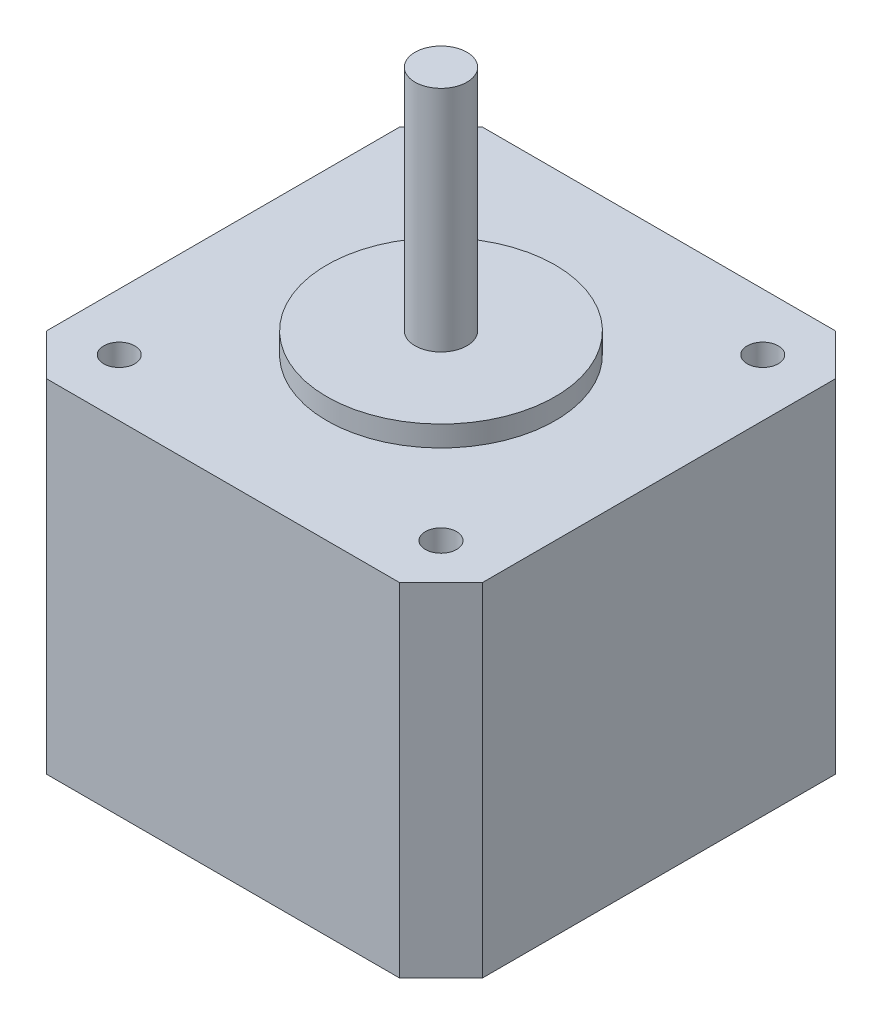
ISO-10303-21;
HEADER;
FILE_DESCRIPTION(('STEP AP214'),'2;1');
FILE_NAME('part.step','',(''),(''),'','','');
FILE_SCHEMA(('AUTOMOTIVE_DESIGN { 1 0 10303 214 1 1 1 1 }'));
ENDSEC;
DATA;
#1=APPLICATION_CONTEXT('core data for automotive mechanical design processes');
#2=APPLICATION_PROTOCOL_DEFINITION('international standard','automotive_design',2000,#1);
#3=PRODUCT_CONTEXT('',#1,'mechanical');
#4=PRODUCT('Part','Part','',(#3));
#5=PRODUCT_RELATED_PRODUCT_CATEGORY('part','',(#4));
#6=PRODUCT_DEFINITION_FORMATION('','',#4);
#7=PRODUCT_DEFINITION_CONTEXT('part definition',#1,'design');
#8=PRODUCT_DEFINITION('design','',#6,#7);
#9=PRODUCT_DEFINITION_SHAPE('','',#8);
#10=(LENGTH_UNIT() NAMED_UNIT(*) SI_UNIT(.MILLI.,.METRE.));
#11=(NAMED_UNIT(*) PLANE_ANGLE_UNIT() SI_UNIT($,.RADIAN.));
#12=(NAMED_UNIT(*) SI_UNIT($,.STERADIAN.) SOLID_ANGLE_UNIT());
#13=UNCERTAINTY_MEASURE_WITH_UNIT(LENGTH_MEASURE(1.E-05),#10,'distance_accuracy_value','');
#14=(GEOMETRIC_REPRESENTATION_CONTEXT(3) GLOBAL_UNCERTAINTY_ASSIGNED_CONTEXT((#13)) GLOBAL_UNIT_ASSIGNED_CONTEXT((#10,
#11,#12)) REPRESENTATION_CONTEXT('',''));
#15=CARTESIAN_POINT('',(0.,0.,0.));
#16=DIRECTION('',(0.,0.,1.));
#17=DIRECTION('',(1.,0.,0.));
#18=AXIS2_PLACEMENT_3D('',#15,#16,#17);
#19=CARTESIAN_POINT('',(0.,33.,0.));
#20=DIRECTION('',(0.,1.,0.));
#21=DIRECTION('',(0.,0.,1.));
#22=AXIS2_PLACEMENT_3D('',#19,#20,#21);
#23=PLANE('',#22);
#24=CARTESIAN_POINT('',(0.,33.,0.));
#25=DIRECTION('',(0.,1.,0.));
#26=DIRECTION('',(0.,0.,1.));
#27=AXIS2_PLACEMENT_3D('',#24,#25,#26);
#28=CIRCLE('',#27,11.);
#29=CARTESIAN_POINT('',(0.,33.,11.));
#30=VERTEX_POINT('',#29);
#31=EDGE_CURVE('E207',#30,#30,#28,.T.);
#32=ORIENTED_EDGE('',*,*,#31,.F.);
#33=EDGE_LOOP('',(#32));
#34=FACE_BOUND('',#33,.T.);
#35=CARTESIAN_POINT('',(15.5,33.,15.5));
#36=DIRECTION('',(0.,1.,0.));
#37=DIRECTION('',(0.,0.,-1.));
#38=AXIS2_PLACEMENT_3D('',#35,#36,#37);
#39=CIRCLE('',#38,1.5);
#40=CARTESIAN_POINT('',(15.5,33.,14.));
#41=VERTEX_POINT('',#40);
#42=EDGE_CURVE('E192',#41,#41,#39,.T.);
#43=ORIENTED_EDGE('',*,*,#42,.F.);
#44=EDGE_LOOP('',(#43));
#45=FACE_BOUND('',#44,.T.);
#46=CARTESIAN_POINT('',(15.5,33.,-15.5));
#47=DIRECTION('',(0.,1.,0.));
#48=DIRECTION('',(0.,0.,1.));
#49=AXIS2_PLACEMENT_3D('',#46,#47,#48);
#50=CIRCLE('',#49,1.5);
#51=CARTESIAN_POINT('',(15.5,33.,-14.));
#52=VERTEX_POINT('',#51);
#53=EDGE_CURVE('E176',#52,#52,#50,.T.);
#54=ORIENTED_EDGE('',*,*,#53,.F.);
#55=EDGE_LOOP('',(#54));
#56=FACE_BOUND('',#55,.T.);
#57=DIRECTION('',(0.,0.,1.));
#58=VECTOR('',#57,1.);
#59=CARTESIAN_POINT('',(-21.,33.,-21.));
#60=LINE('',#59,#58);
#61=CARTESIAN_POINT('',(-21.,33.,-17.));
#62=VERTEX_POINT('',#61);
#63=CARTESIAN_POINT('',(-21.,33.,17.));
#64=VERTEX_POINT('',#63);
#65=EDGE_CURVE('E180',#62,#64,#60,.T.);
#66=ORIENTED_EDGE('',*,*,#65,.T.);
#67=DIRECTION('',(-0.707106781186546,0.,-0.707106781186549));
#68=VECTOR('',#67,1.);
#69=CARTESIAN_POINT('',(-19.,33.,19.));
#70=LINE('',#69,#68);
#71=CARTESIAN_POINT('',(-17.,33.,21.));
#72=VERTEX_POINT('',#71);
#73=EDGE_CURVE('E154',#64,#72,#70,.F.);
#74=ORIENTED_EDGE('',*,*,#73,.T.);
#75=DIRECTION('',(1.,0.,0.));
#76=VECTOR('',#75,1.);
#77=CARTESIAN_POINT('',(-21.,33.,21.));
#78=LINE('',#77,#76);
#79=CARTESIAN_POINT('',(17.,33.,21.));
#80=VERTEX_POINT('',#79);
#81=EDGE_CURVE('E125',#72,#80,#78,.T.);
#82=ORIENTED_EDGE('',*,*,#81,.T.);
#83=DIRECTION('',(-0.707106781186549,0.,0.707106781186546));
#84=VECTOR('',#83,1.);
#85=CARTESIAN_POINT('',(19.,33.,19.));
#86=LINE('',#85,#84);
#87=CARTESIAN_POINT('',(21.,33.,17.));
#88=VERTEX_POINT('',#87);
#89=EDGE_CURVE('E149',#80,#88,#86,.F.);
#90=ORIENTED_EDGE('',*,*,#89,.T.);
#91=DIRECTION('',(0.,0.,-1.));
#92=VECTOR('',#91,1.);
#93=CARTESIAN_POINT('',(21.,33.,-21.));
#94=LINE('',#93,#92);
#95=CARTESIAN_POINT('',(21.,33.,-17.));
#96=VERTEX_POINT('',#95);
#97=EDGE_CURVE('E132',#88,#96,#94,.T.);
#98=ORIENTED_EDGE('',*,*,#97,.T.);
#99=DIRECTION('',(0.707106781186546,0.,0.707106781186549));
#100=VECTOR('',#99,1.);
#101=CARTESIAN_POINT('',(19.,33.,-19.));
#102=LINE('',#101,#100);
#103=CARTESIAN_POINT('',(17.,33.,-21.));
#104=VERTEX_POINT('',#103);
#105=EDGE_CURVE('E60',#96,#104,#102,.F.);
#106=ORIENTED_EDGE('',*,*,#105,.T.);
#107=DIRECTION('',(-1.,0.,0.));
#108=VECTOR('',#107,1.);
#109=CARTESIAN_POINT('',(-21.,33.,-21.));
#110=LINE('',#109,#108);
#111=CARTESIAN_POINT('',(-17.,33.,-21.));
#112=VERTEX_POINT('',#111);
#113=EDGE_CURVE('E135',#104,#112,#110,.T.);
#114=ORIENTED_EDGE('',*,*,#113,.T.);
#115=DIRECTION('',(0.707106781186549,0.,-0.707106781186546));
#116=VECTOR('',#115,1.);
#117=CARTESIAN_POINT('',(-19.,33.,-19.));
#118=LINE('',#117,#116);
#119=EDGE_CURVE('E152',#112,#62,#118,.F.);
#120=ORIENTED_EDGE('',*,*,#119,.T.);
#121=EDGE_LOOP('',(#66,#74,#82,#90,#98,#106,#114,#120));
#122=FACE_BOUND('',#121,.T.);
#123=CARTESIAN_POINT('',(-15.5,33.,-15.5));
#124=DIRECTION('',(0.,1.,0.));
#125=DIRECTION('',(0.,0.,1.));
#126=AXIS2_PLACEMENT_3D('',#123,#124,#125);
#127=CIRCLE('',#126,1.5);
#128=CARTESIAN_POINT('',(-15.5,33.,-14.));
#129=VERTEX_POINT('',#128);
#130=EDGE_CURVE('E186',#129,#129,#127,.T.);
#131=ORIENTED_EDGE('',*,*,#130,.F.);
#132=EDGE_LOOP('',(#131));
#133=FACE_BOUND('',#132,.T.);
#134=CARTESIAN_POINT('',(-15.5,33.,15.5));
#135=DIRECTION('',(0.,1.,0.));
#136=DIRECTION('',(0.,0.,-1.));
#137=AXIS2_PLACEMENT_3D('',#134,#135,#136);
#138=CIRCLE('',#137,1.5);
#139=CARTESIAN_POINT('',(-15.5,33.,14.));
#140=VERTEX_POINT('',#139);
#141=EDGE_CURVE('E198',#140,#140,#138,.T.);
#142=ORIENTED_EDGE('',*,*,#141,.F.);
#143=EDGE_LOOP('',(#142));
#144=FACE_BOUND('',#143,.T.);
#145=ADVANCED_FACE('F36',(#34,#45,#56,#122,#133,#144),#23,.T.);
#146=CARTESIAN_POINT('',(0.,0.,0.));
#147=DIRECTION('',(0.,1.,0.));
#148=DIRECTION('',(0.,0.,1.));
#149=AXIS2_PLACEMENT_3D('',#146,#147,#148);
#150=PLANE('',#149);
#151=DIRECTION('',(1.,0.,0.));
#152=VECTOR('',#151,1.);
#153=CARTESIAN_POINT('',(-21.,0.,21.));
#154=LINE('',#153,#152);
#155=CARTESIAN_POINT('',(-17.,0.,21.));
#156=VERTEX_POINT('',#155);
#157=CARTESIAN_POINT('',(17.,0.,21.));
#158=VERTEX_POINT('',#157);
#159=EDGE_CURVE('E122',#156,#158,#154,.T.);
#160=ORIENTED_EDGE('',*,*,#159,.F.);
#161=DIRECTION('',(0.707106781186546,0.,0.707106781186549));
#162=VECTOR('',#161,1.);
#163=CARTESIAN_POINT('',(-17.,0.,21.));
#164=LINE('',#163,#162);
#165=CARTESIAN_POINT('',(-21.,0.,17.));
#166=VERTEX_POINT('',#165);
#167=EDGE_CURVE('E105',#156,#166,#164,.F.);
#168=ORIENTED_EDGE('',*,*,#167,.T.);
#169=DIRECTION('',(0.,0.,1.));
#170=VECTOR('',#169,1.);
#171=CARTESIAN_POINT('',(-21.,0.,-21.));
#172=LINE('',#171,#170);
#173=CARTESIAN_POINT('',(-21.,0.,-17.));
#174=VERTEX_POINT('',#173);
#175=EDGE_CURVE('E133',#174,#166,#172,.T.);
#176=ORIENTED_EDGE('',*,*,#175,.F.);
#177=DIRECTION('',(-0.707106781186549,0.,0.707106781186546));
#178=VECTOR('',#177,1.);
#179=CARTESIAN_POINT('',(-21.,0.,-17.));
#180=LINE('',#179,#178);
#181=CARTESIAN_POINT('',(-17.,0.,-21.));
#182=VERTEX_POINT('',#181);
#183=EDGE_CURVE('E116',#174,#182,#180,.F.);
#184=ORIENTED_EDGE('',*,*,#183,.T.);
#185=DIRECTION('',(-1.,0.,0.));
#186=VECTOR('',#185,1.);
#187=CARTESIAN_POINT('',(-21.,0.,-21.));
#188=LINE('',#187,#186);
#189=CARTESIAN_POINT('',(17.,0.,-21.));
#190=VERTEX_POINT('',#189);
#191=EDGE_CURVE('E137',#190,#182,#188,.T.);
#192=ORIENTED_EDGE('',*,*,#191,.F.);
#193=DIRECTION('',(-0.707106781186546,0.,-0.707106781186549));
#194=VECTOR('',#193,1.);
#195=CARTESIAN_POINT('',(17.,0.,-21.));
#196=LINE('',#195,#194);
#197=CARTESIAN_POINT('',(21.,0.,-17.));
#198=VERTEX_POINT('',#197);
#199=EDGE_CURVE('E143',#190,#198,#196,.F.);
#200=ORIENTED_EDGE('',*,*,#199,.T.);
#201=DIRECTION('',(0.,0.,-1.));
#202=VECTOR('',#201,1.);
#203=CARTESIAN_POINT('',(21.,0.,-21.));
#204=LINE('',#203,#202);
#205=CARTESIAN_POINT('',(21.,0.,17.));
#206=VERTEX_POINT('',#205);
#207=EDGE_CURVE('E167',#206,#198,#204,.T.);
#208=ORIENTED_EDGE('',*,*,#207,.F.);
#209=DIRECTION('',(0.707106781186549,0.,-0.707106781186546));
#210=VECTOR('',#209,1.);
#211=CARTESIAN_POINT('',(21.,0.,17.));
#212=LINE('',#211,#210);
#213=EDGE_CURVE('E126',#206,#158,#212,.F.);
#214=ORIENTED_EDGE('',*,*,#213,.T.);
#215=EDGE_LOOP('',(#160,#168,#176,#184,#192,#200,#208,#214));
#216=FACE_BOUND('',#215,.T.);
#217=CARTESIAN_POINT('',(15.5,0.,-15.5));
#218=DIRECTION('',(0.,1.,0.));
#219=DIRECTION('',(0.,0.,1.));
#220=AXIS2_PLACEMENT_3D('',#217,#218,#219);
#221=CIRCLE('',#220,1.5);
#222=CARTESIAN_POINT('',(15.5,0.,-14.));
#223=VERTEX_POINT('',#222);
#224=EDGE_CURVE('E183',#223,#223,#221,.T.);
#225=ORIENTED_EDGE('',*,*,#224,.T.);
#226=EDGE_LOOP('',(#225));
#227=FACE_BOUND('',#226,.T.);
#228=CARTESIAN_POINT('',(-15.5,0.,-15.5));
#229=DIRECTION('',(0.,1.,0.));
#230=DIRECTION('',(0.,0.,1.));
#231=AXIS2_PLACEMENT_3D('',#228,#229,#230);
#232=CIRCLE('',#231,1.5);
#233=CARTESIAN_POINT('',(-15.5,0.,-14.));
#234=VERTEX_POINT('',#233);
#235=EDGE_CURVE('E189',#234,#234,#232,.T.);
#236=ORIENTED_EDGE('',*,*,#235,.T.);
#237=EDGE_LOOP('',(#236));
#238=FACE_BOUND('',#237,.T.);
#239=CARTESIAN_POINT('',(15.5,0.,15.5));
#240=DIRECTION('',(0.,1.,0.));
#241=DIRECTION('',(0.,0.,-1.));
#242=AXIS2_PLACEMENT_3D('',#239,#240,#241);
#243=CIRCLE('',#242,1.5);
#244=CARTESIAN_POINT('',(15.5,0.,14.));
#245=VERTEX_POINT('',#244);
#246=EDGE_CURVE('E195',#245,#245,#243,.T.);
#247=ORIENTED_EDGE('',*,*,#246,.T.);
#248=EDGE_LOOP('',(#247));
#249=FACE_BOUND('',#248,.T.);
#250=CARTESIAN_POINT('',(-15.5,0.,15.5));
#251=DIRECTION('',(0.,1.,0.));
#252=DIRECTION('',(0.,0.,-1.));
#253=AXIS2_PLACEMENT_3D('',#250,#251,#252);
#254=CIRCLE('',#253,1.5);
#255=CARTESIAN_POINT('',(-15.5,0.,14.));
#256=VERTEX_POINT('',#255);
#257=EDGE_CURVE('E201',#256,#256,#254,.T.);
#258=ORIENTED_EDGE('',*,*,#257,.T.);
#259=EDGE_LOOP('',(#258));
#260=FACE_BOUND('',#259,.T.);
#261=ADVANCED_FACE('F129',(#216,#227,#238,#249,#260),#150,.F.);
#262=CARTESIAN_POINT('',(21.,33.,-21.));
#263=DIRECTION('',(-1.,0.,0.));
#264=DIRECTION('',(0.,0.,1.));
#265=AXIS2_PLACEMENT_3D('',#262,#263,#264);
#266=PLANE('',#265);
#267=ORIENTED_EDGE('',*,*,#207,.T.);
#268=DIRECTION('',(0.,1.,0.));
#269=VECTOR('',#268,1.);
#270=CARTESIAN_POINT('',(21.,33.,-17.));
#271=LINE('',#270,#269);
#272=EDGE_CURVE('E41',#198,#96,#271,.T.);
#273=ORIENTED_EDGE('',*,*,#272,.T.);
#274=ORIENTED_EDGE('',*,*,#97,.F.);
#275=DIRECTION('',(0.,-1.,0.));
#276=VECTOR('',#275,1.);
#277=CARTESIAN_POINT('',(21.,33.,17.));
#278=LINE('',#277,#276);
#279=EDGE_CURVE('E159',#88,#206,#278,.T.);
#280=ORIENTED_EDGE('',*,*,#279,.T.);
#281=EDGE_LOOP('',(#267,#273,#274,#280));
#282=FACE_BOUND('',#281,.T.);
#283=ADVANCED_FACE('F166',(#282),#266,.F.);
#284=CARTESIAN_POINT('',(-21.,33.,-21.));
#285=DIRECTION('',(0.,0.,1.));
#286=DIRECTION('',(1.,0.,0.));
#287=AXIS2_PLACEMENT_3D('',#284,#285,#286);
#288=PLANE('',#287);
#289=ORIENTED_EDGE('',*,*,#191,.T.);
#290=DIRECTION('',(0.,1.,0.));
#291=VECTOR('',#290,1.);
#292=CARTESIAN_POINT('',(-17.,33.,-21.));
#293=LINE('',#292,#291);
#294=EDGE_CURVE('E53',#182,#112,#293,.T.);
#295=ORIENTED_EDGE('',*,*,#294,.T.);
#296=ORIENTED_EDGE('',*,*,#113,.F.);
#297=DIRECTION('',(0.,-1.,0.));
#298=VECTOR('',#297,1.);
#299=CARTESIAN_POINT('',(17.,33.,-21.));
#300=LINE('',#299,#298);
#301=EDGE_CURVE('E156',#104,#190,#300,.T.);
#302=ORIENTED_EDGE('',*,*,#301,.T.);
#303=EDGE_LOOP('',(#289,#295,#296,#302));
#304=FACE_BOUND('',#303,.T.);
#305=ADVANCED_FACE('F175',(#304),#288,.F.);
#306=CARTESIAN_POINT('',(-21.,33.,-21.));
#307=DIRECTION('',(1.,0.,0.));
#308=DIRECTION('',(0.,0.,-1.));
#309=AXIS2_PLACEMENT_3D('',#306,#307,#308);
#310=PLANE('',#309);
#311=ORIENTED_EDGE('',*,*,#175,.T.);
#312=DIRECTION('',(0.,1.,0.));
#313=VECTOR('',#312,1.);
#314=CARTESIAN_POINT('',(-21.,33.,17.));
#315=LINE('',#314,#313);
#316=EDGE_CURVE('E110',#166,#64,#315,.T.);
#317=ORIENTED_EDGE('',*,*,#316,.T.);
#318=ORIENTED_EDGE('',*,*,#65,.F.);
#319=DIRECTION('',(0.,-1.,0.));
#320=VECTOR('',#319,1.);
#321=CARTESIAN_POINT('',(-21.,33.,-17.));
#322=LINE('',#321,#320);
#323=EDGE_CURVE('E115',#62,#174,#322,.T.);
#324=ORIENTED_EDGE('',*,*,#323,.T.);
#325=EDGE_LOOP('',(#311,#317,#318,#324));
#326=FACE_BOUND('',#325,.T.);
#327=ADVANCED_FACE('F277',(#326),#310,.F.);
#328=CARTESIAN_POINT('',(-21.,33.,21.));
#329=DIRECTION('',(0.,0.,-1.));
#330=DIRECTION('',(-1.,0.,0.));
#331=AXIS2_PLACEMENT_3D('',#328,#329,#330);
#332=PLANE('',#331);
#333=ORIENTED_EDGE('',*,*,#81,.F.);
#334=DIRECTION('',(0.,-1.,0.));
#335=VECTOR('',#334,1.);
#336=CARTESIAN_POINT('',(-17.,33.,21.));
#337=LINE('',#336,#335);
#338=EDGE_CURVE('E109',#72,#156,#337,.T.);
#339=ORIENTED_EDGE('',*,*,#338,.T.);
#340=ORIENTED_EDGE('',*,*,#159,.T.);
#341=DIRECTION('',(0.,1.,0.));
#342=VECTOR('',#341,1.);
#343=CARTESIAN_POINT('',(17.,33.,21.));
#344=LINE('',#343,#342);
#345=EDGE_CURVE('E127',#158,#80,#344,.T.);
#346=ORIENTED_EDGE('',*,*,#345,.T.);
#347=EDGE_LOOP('',(#333,#339,#340,#346));
#348=FACE_BOUND('',#347,.T.);
#349=ADVANCED_FACE('F121',(#348),#332,.F.);
#350=CARTESIAN_POINT('',(15.5,33.,-15.5));
#351=DIRECTION('',(0.,-1.,0.));
#352=DIRECTION('',(0.,0.,-1.));
#353=AXIS2_PLACEMENT_3D('',#350,#351,#352);
#354=CYLINDRICAL_SURFACE('',#353,1.5);
#355=ORIENTED_EDGE('',*,*,#53,.T.);
#356=EDGE_LOOP('',(#355));
#357=FACE_BOUND('',#356,.T.);
#358=ORIENTED_EDGE('',*,*,#224,.F.);
#359=EDGE_LOOP('',(#358));
#360=FACE_BOUND('',#359,.T.);
#361=ADVANCED_FACE('F243',(#357,#360),#354,.F.);
#362=CARTESIAN_POINT('',(-15.5,33.,-15.5));
#363=DIRECTION('',(0.,-1.,0.));
#364=DIRECTION('',(0.,0.,-1.));
#365=AXIS2_PLACEMENT_3D('',#362,#363,#364);
#366=CYLINDRICAL_SURFACE('',#365,1.5);
#367=ORIENTED_EDGE('',*,*,#130,.T.);
#368=EDGE_LOOP('',(#367));
#369=FACE_BOUND('',#368,.T.);
#370=ORIENTED_EDGE('',*,*,#235,.F.);
#371=EDGE_LOOP('',(#370));
#372=FACE_BOUND('',#371,.T.);
#373=ADVANCED_FACE('F246',(#369,#372),#366,.F.);
#374=CARTESIAN_POINT('',(15.5,33.,15.5));
#375=DIRECTION('',(0.,-1.,0.));
#376=DIRECTION('',(0.,0.,-1.));
#377=AXIS2_PLACEMENT_3D('',#374,#375,#376);
#378=CYLINDRICAL_SURFACE('',#377,1.5);
#379=ORIENTED_EDGE('',*,*,#42,.T.);
#380=EDGE_LOOP('',(#379));
#381=FACE_BOUND('',#380,.T.);
#382=ORIENTED_EDGE('',*,*,#246,.F.);
#383=EDGE_LOOP('',(#382));
#384=FACE_BOUND('',#383,.T.);
#385=ADVANCED_FACE('F260',(#381,#384),#378,.F.);
#386=CARTESIAN_POINT('',(-15.5,33.,15.5));
#387=DIRECTION('',(0.,-1.,0.));
#388=DIRECTION('',(0.,0.,-1.));
#389=AXIS2_PLACEMENT_3D('',#386,#387,#388);
#390=CYLINDRICAL_SURFACE('',#389,1.5);
#391=ORIENTED_EDGE('',*,*,#141,.T.);
#392=EDGE_LOOP('',(#391));
#393=FACE_BOUND('',#392,.T.);
#394=ORIENTED_EDGE('',*,*,#257,.F.);
#395=EDGE_LOOP('',(#394));
#396=FACE_BOUND('',#395,.T.);
#397=ADVANCED_FACE('F258',(#393,#396),#390,.F.);
#398=CARTESIAN_POINT('',(-17.,33.,21.));
#399=DIRECTION('',(0.707106781186549,0.,-0.707106781186546));
#400=DIRECTION('',(0.,-1.,0.));
#401=AXIS2_PLACEMENT_3D('',#398,#399,#400);
#402=PLANE('',#401);
#403=ORIENTED_EDGE('',*,*,#73,.F.);
#404=ORIENTED_EDGE('',*,*,#316,.F.);
#405=ORIENTED_EDGE('',*,*,#167,.F.);
#406=ORIENTED_EDGE('',*,*,#338,.F.);
#407=EDGE_LOOP('',(#403,#404,#405,#406));
#408=FACE_BOUND('',#407,.T.);
#409=ADVANCED_FACE('F108',(#408),#402,.F.);
#410=CARTESIAN_POINT('',(-21.,33.,-17.));
#411=DIRECTION('',(0.707106781186546,0.,0.707106781186549));
#412=DIRECTION('',(0.,-1.,0.));
#413=AXIS2_PLACEMENT_3D('',#410,#411,#412);
#414=PLANE('',#413);
#415=ORIENTED_EDGE('',*,*,#119,.F.);
#416=ORIENTED_EDGE('',*,*,#294,.F.);
#417=ORIENTED_EDGE('',*,*,#183,.F.);
#418=ORIENTED_EDGE('',*,*,#323,.F.);
#419=EDGE_LOOP('',(#415,#416,#417,#418));
#420=FACE_BOUND('',#419,.T.);
#421=ADVANCED_FACE('F267',(#420),#414,.F.);
#422=CARTESIAN_POINT('',(17.,33.,-21.));
#423=DIRECTION('',(-0.707106781186549,0.,0.707106781186546));
#424=DIRECTION('',(0.,-1.,0.));
#425=AXIS2_PLACEMENT_3D('',#422,#423,#424);
#426=PLANE('',#425);
#427=ORIENTED_EDGE('',*,*,#105,.F.);
#428=ORIENTED_EDGE('',*,*,#272,.F.);
#429=ORIENTED_EDGE('',*,*,#199,.F.);
#430=ORIENTED_EDGE('',*,*,#301,.F.);
#431=EDGE_LOOP('',(#427,#428,#429,#430));
#432=FACE_BOUND('',#431,.T.);
#433=ADVANCED_FACE('F173',(#432),#426,.F.);
#434=CARTESIAN_POINT('',(21.,33.,17.));
#435=DIRECTION('',(-0.707106781186546,0.,-0.707106781186549));
#436=DIRECTION('',(0.,-1.,0.));
#437=AXIS2_PLACEMENT_3D('',#434,#435,#436);
#438=PLANE('',#437);
#439=ORIENTED_EDGE('',*,*,#89,.F.);
#440=ORIENTED_EDGE('',*,*,#345,.F.);
#441=ORIENTED_EDGE('',*,*,#213,.F.);
#442=ORIENTED_EDGE('',*,*,#279,.F.);
#443=EDGE_LOOP('',(#439,#440,#441,#442));
#444=FACE_BOUND('',#443,.T.);
#445=ADVANCED_FACE('F39',(#444),#438,.F.);
#446=CARTESIAN_POINT('',(0.,35.,0.));
#447=DIRECTION('',(0.,-1.,0.));
#448=DIRECTION('',(0.,0.,-1.));
#449=AXIS2_PLACEMENT_3D('',#446,#447,#448);
#450=CYLINDRICAL_SURFACE('',#449,11.);
#451=CARTESIAN_POINT('',(0.,35.,0.));
#452=DIRECTION('',(0.,1.,0.));
#453=DIRECTION('',(0.,0.,1.));
#454=AXIS2_PLACEMENT_3D('',#451,#452,#453);
#455=CIRCLE('',#454,11.);
#456=CARTESIAN_POINT('',(0.,35.,11.));
#457=VERTEX_POINT('',#456);
#458=EDGE_CURVE('E204',#457,#457,#455,.T.);
#459=ORIENTED_EDGE('',*,*,#458,.F.);
#460=EDGE_LOOP('',(#459));
#461=FACE_BOUND('',#460,.T.);
#462=ORIENTED_EDGE('',*,*,#31,.T.);
#463=EDGE_LOOP('',(#462));
#464=FACE_BOUND('',#463,.T.);
#465=ADVANCED_FACE('F227',(#461,#464),#450,.T.);
#466=CARTESIAN_POINT('',(0.,35.,0.));
#467=DIRECTION('',(0.,1.,0.));
#468=DIRECTION('',(0.,0.,1.));
#469=AXIS2_PLACEMENT_3D('',#466,#467,#468);
#470=PLANE('',#469);
#471=CARTESIAN_POINT('',(0.,35.,0.));
#472=DIRECTION('',(0.,1.,0.));
#473=DIRECTION('',(0.,0.,1.));
#474=AXIS2_PLACEMENT_3D('',#471,#472,#473);
#475=CIRCLE('',#474,2.5);
#476=CARTESIAN_POINT('',(0.,35.,2.5));
#477=VERTEX_POINT('',#476);
#478=EDGE_CURVE('E11',#477,#477,#475,.T.);
#479=ORIENTED_EDGE('',*,*,#478,.F.);
#480=EDGE_LOOP('',(#479));
#481=FACE_BOUND('',#480,.T.);
#482=ORIENTED_EDGE('',*,*,#458,.T.);
#483=EDGE_LOOP('',(#482));
#484=FACE_BOUND('',#483,.T.);
#485=ADVANCED_FACE('F221',(#481,#484),#470,.T.);
#486=CARTESIAN_POINT('',(0.,57.,0.));
#487=DIRECTION('',(0.,-1.,0.));
#488=DIRECTION('',(0.,0.,-1.));
#489=AXIS2_PLACEMENT_3D('',#486,#487,#488);
#490=CYLINDRICAL_SURFACE('',#489,2.5);
#491=CARTESIAN_POINT('',(0.,57.,0.));
#492=DIRECTION('',(0.,1.,0.));
#493=DIRECTION('',(0.,0.,1.));
#494=AXIS2_PLACEMENT_3D('',#491,#492,#493);
#495=CIRCLE('',#494,2.5);
#496=CARTESIAN_POINT('',(0.,57.,2.5));
#497=VERTEX_POINT('',#496);
#498=EDGE_CURVE('E210',#497,#497,#495,.T.);
#499=ORIENTED_EDGE('',*,*,#498,.F.);
#500=EDGE_LOOP('',(#499));
#501=FACE_BOUND('',#500,.T.);
#502=ORIENTED_EDGE('',*,*,#478,.T.);
#503=EDGE_LOOP('',(#502));
#504=FACE_BOUND('',#503,.T.);
#505=ADVANCED_FACE('F218',(#501,#504),#490,.T.);
#506=CARTESIAN_POINT('',(0.,57.,0.));
#507=DIRECTION('',(0.,1.,0.));
#508=DIRECTION('',(0.,0.,1.));
#509=AXIS2_PLACEMENT_3D('',#506,#507,#508);
#510=PLANE('',#509);
#511=ORIENTED_EDGE('',*,*,#498,.T.);
#512=EDGE_LOOP('',(#511));
#513=FACE_BOUND('',#512,.T.);
#514=ADVANCED_FACE('F216',(#513),#510,.T.);
#515=CLOSED_SHELL('',(#145,#261,#283,#305,#327,#349,#361,#373,#385,#397,#409,#421,#433,#445,
#465,#485,#505,#514));
#516=MANIFOLD_SOLID_BREP('B2',#515);
#517=ADVANCED_BREP_SHAPE_REPRESENTATION('',(#18,#516),#14);
#518=SHAPE_DEFINITION_REPRESENTATION(#9,#517);
ENDSEC;
END-ISO-10303-21;
